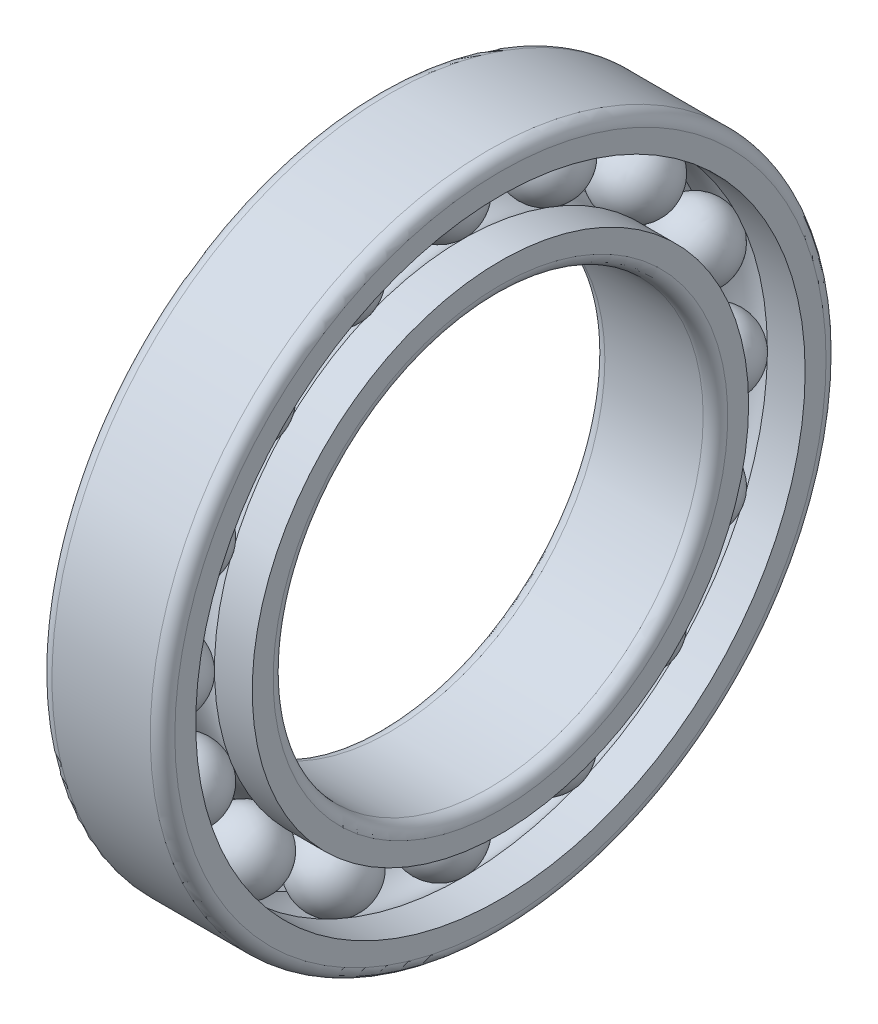
ISO-10303-21;
HEADER;
FILE_DESCRIPTION(('STEP AP214'),'2;1');
FILE_NAME('part.step','',(''),(''),'','','');
FILE_SCHEMA(('AUTOMOTIVE_DESIGN { 1 0 10303 214 1 1 1 1 }'));
ENDSEC;
DATA;
#1=APPLICATION_CONTEXT('core data for automotive mechanical design processes');
#2=APPLICATION_PROTOCOL_DEFINITION('international standard','automotive_design',2000,#1);
#3=PRODUCT_CONTEXT('',#1,'mechanical');
#4=PRODUCT('Part','Part','',(#3));
#5=PRODUCT_RELATED_PRODUCT_CATEGORY('part','',(#4));
#6=PRODUCT_DEFINITION_FORMATION('','',#4);
#7=PRODUCT_DEFINITION_CONTEXT('part definition',#1,'design');
#8=PRODUCT_DEFINITION('design','',#6,#7);
#9=PRODUCT_DEFINITION_SHAPE('','',#8);
#10=(LENGTH_UNIT() NAMED_UNIT(*) SI_UNIT(.MILLI.,.METRE.));
#11=(NAMED_UNIT(*) PLANE_ANGLE_UNIT() SI_UNIT($,.RADIAN.));
#12=(NAMED_UNIT(*) SI_UNIT($,.STERADIAN.) SOLID_ANGLE_UNIT());
#13=UNCERTAINTY_MEASURE_WITH_UNIT(LENGTH_MEASURE(1.E-05),#10,'distance_accuracy_value','');
#14=(GEOMETRIC_REPRESENTATION_CONTEXT(3) GLOBAL_UNCERTAINTY_ASSIGNED_CONTEXT((#13)) GLOBAL_UNIT_ASSIGNED_CONTEXT((#10,
#11,#12)) REPRESENTATION_CONTEXT('',''));
#15=CARTESIAN_POINT('',(0.,0.,0.));
#16=DIRECTION('',(0.,0.,1.));
#17=DIRECTION('',(1.,0.,0.));
#18=AXIS2_PLACEMENT_3D('',#15,#16,#17);
#19=CARTESIAN_POINT('',(0.,-15.9099025766973,15.9099025766973));
#20=DIRECTION('',(1.,0.,0.));
#21=DIRECTION('',(0.,-0.707106781186548,-0.707106781186547));
#22=AXIS2_PLACEMENT_3D('',#19,#20,#21);
#23=SPHERICAL_SURFACE('',#22,3.);
#24=CARTESIAN_POINT('',(-2.99999999999999,-15.9099025766973,15.9099025766973));
#25=VERTEX_POINT('',#24);
#26=VERTEX_LOOP('',#25);
#27=FACE_BOUND('',#26,.T.);
#28=CARTESIAN_POINT('',(3.00000000000001,-15.9099025766973,15.9099025766973));
#29=VERTEX_POINT('',#28);
#30=VERTEX_LOOP('',#29);
#31=FACE_BOUND('',#30,.T.);
#32=ADVANCED_FACE('P0_F15',(#27,#31),#23,.T.);
#33=CLOSED_SHELL('',(#32));
#34=MANIFOLD_SOLID_BREP('P0_B1',#33);
#35=CARTESIAN_POINT('',(0.,-8.61037722821452,20.787289481504));
#36=DIRECTION('',(1.,0.,0.));
#37=DIRECTION('',(0.,-0.923879532511287,-0.38268343236509));
#38=AXIS2_PLACEMENT_3D('',#35,#36,#37);
#39=SPHERICAL_SURFACE('',#38,3.);
#40=CARTESIAN_POINT('',(-2.99999999999999,-8.61037722821452,20.787289481504));
#41=VERTEX_POINT('',#40);
#42=VERTEX_LOOP('',#41);
#43=FACE_BOUND('',#42,.T.);
#44=CARTESIAN_POINT('',(3.00000000000001,-8.61037722821452,20.787289481504));
#45=VERTEX_POINT('',#44);
#46=VERTEX_LOOP('',#45);
#47=FACE_BOUND('',#46,.T.);
#48=ADVANCED_FACE('P1_F15',(#43,#47),#39,.T.);
#49=CLOSED_SHELL('',(#48));
#50=MANIFOLD_SOLID_BREP('P1_B1',#49);
#51=CARTESIAN_POINT('',(0.,-20.787289481504,8.61037722821452));
#52=DIRECTION('',(1.,0.,0.));
#53=DIRECTION('',(0.,-0.38268343236509,-0.923879532511287));
#54=AXIS2_PLACEMENT_3D('',#51,#52,#53);
#55=SPHERICAL_SURFACE('',#54,3.);
#56=CARTESIAN_POINT('',(-2.99999999999999,-20.787289481504,8.61037722821452));
#57=VERTEX_POINT('',#56);
#58=VERTEX_LOOP('',#57);
#59=FACE_BOUND('',#58,.T.);
#60=CARTESIAN_POINT('',(3.00000000000001,-20.787289481504,8.61037722821452));
#61=VERTEX_POINT('',#60);
#62=VERTEX_LOOP('',#61);
#63=FACE_BOUND('',#62,.T.);
#64=ADVANCED_FACE('P2_F15',(#59,#63),#55,.T.);
#65=CLOSED_SHELL('',(#64));
#66=MANIFOLD_SOLID_BREP('P2_B1',#65);
#67=CARTESIAN_POINT('',(0.,-22.5,0.));
#68=DIRECTION('',(1.,0.,0.));
#69=DIRECTION('',(0.,0.,-1.));
#70=AXIS2_PLACEMENT_3D('',#67,#68,#69);
#71=SPHERICAL_SURFACE('',#70,3.);
#72=CARTESIAN_POINT('',(-2.99999999999999,-22.5,0.));
#73=VERTEX_POINT('',#72);
#74=VERTEX_LOOP('',#73);
#75=FACE_BOUND('',#74,.T.);
#76=CARTESIAN_POINT('',(3.00000000000001,-22.5,0.));
#77=VERTEX_POINT('',#76);
#78=VERTEX_LOOP('',#77);
#79=FACE_BOUND('',#78,.T.);
#80=ADVANCED_FACE('P3_F15',(#75,#79),#71,.T.);
#81=CLOSED_SHELL('',(#80));
#82=MANIFOLD_SOLID_BREP('P3_B1',#81);
#83=CARTESIAN_POINT('',(0.,-20.787289481504,-8.61037722821452));
#84=DIRECTION('',(1.,0.,0.));
#85=DIRECTION('',(0.,0.38268343236509,-0.923879532511287));
#86=AXIS2_PLACEMENT_3D('',#83,#84,#85);
#87=SPHERICAL_SURFACE('',#86,3.);
#88=CARTESIAN_POINT('',(-2.99999999999999,-20.787289481504,-8.61037722821452));
#89=VERTEX_POINT('',#88);
#90=VERTEX_LOOP('',#89);
#91=FACE_BOUND('',#90,.T.);
#92=CARTESIAN_POINT('',(3.00000000000001,-20.787289481504,-8.61037722821452));
#93=VERTEX_POINT('',#92);
#94=VERTEX_LOOP('',#93);
#95=FACE_BOUND('',#94,.T.);
#96=ADVANCED_FACE('P4_F15',(#91,#95),#87,.T.);
#97=CLOSED_SHELL('',(#96));
#98=MANIFOLD_SOLID_BREP('P4_B1',#97);
#99=CARTESIAN_POINT('',(0.,-15.9099025766973,-15.9099025766973));
#100=DIRECTION('',(1.,0.,0.));
#101=DIRECTION('',(0.,0.707106781186547,-0.707106781186548));
#102=AXIS2_PLACEMENT_3D('',#99,#100,#101);
#103=SPHERICAL_SURFACE('',#102,3.);
#104=CARTESIAN_POINT('',(-2.99999999999999,-15.9099025766973,-15.9099025766973));
#105=VERTEX_POINT('',#104);
#106=VERTEX_LOOP('',#105);
#107=FACE_BOUND('',#106,.T.);
#108=CARTESIAN_POINT('',(3.00000000000001,-15.9099025766973,-15.9099025766973));
#109=VERTEX_POINT('',#108);
#110=VERTEX_LOOP('',#109);
#111=FACE_BOUND('',#110,.T.);
#112=ADVANCED_FACE('P5_F15',(#107,#111),#103,.T.);
#113=CLOSED_SHELL('',(#112));
#114=MANIFOLD_SOLID_BREP('P5_B1',#113);
#115=CARTESIAN_POINT('',(0.,-8.61037722821452,-20.787289481504));
#116=DIRECTION('',(1.,0.,0.));
#117=DIRECTION('',(0.,0.923879532511287,-0.38268343236509));
#118=AXIS2_PLACEMENT_3D('',#115,#116,#117);
#119=SPHERICAL_SURFACE('',#118,3.);
#120=CARTESIAN_POINT('',(-2.99999999999999,-8.61037722821452,-20.787289481504));
#121=VERTEX_POINT('',#120);
#122=VERTEX_LOOP('',#121);
#123=FACE_BOUND('',#122,.T.);
#124=CARTESIAN_POINT('',(3.00000000000001,-8.61037722821452,-20.787289481504));
#125=VERTEX_POINT('',#124);
#126=VERTEX_LOOP('',#125);
#127=FACE_BOUND('',#126,.T.);
#128=ADVANCED_FACE('P6_F15',(#123,#127),#119,.T.);
#129=CLOSED_SHELL('',(#128));
#130=MANIFOLD_SOLID_BREP('P6_B1',#129);
#131=CARTESIAN_POINT('',(0.,0.,-22.5));
#132=DIRECTION('',(1.,0.,0.));
#133=DIRECTION('',(0.,1.,0.));
#134=AXIS2_PLACEMENT_3D('',#131,#132,#133);
#135=SPHERICAL_SURFACE('',#134,3.);
#136=CARTESIAN_POINT('',(-2.99999999999999,0.,-22.5));
#137=VERTEX_POINT('',#136);
#138=VERTEX_LOOP('',#137);
#139=FACE_BOUND('',#138,.T.);
#140=CARTESIAN_POINT('',(3.00000000000001,0.,-22.5));
#141=VERTEX_POINT('',#140);
#142=VERTEX_LOOP('',#141);
#143=FACE_BOUND('',#142,.T.);
#144=ADVANCED_FACE('P7_F15',(#139,#143),#135,.T.);
#145=CLOSED_SHELL('',(#144));
#146=MANIFOLD_SOLID_BREP('P7_B1',#145);
#147=CARTESIAN_POINT('',(0.,8.61037722821452,-20.787289481504));
#148=DIRECTION('',(1.,0.,0.));
#149=DIRECTION('',(0.,0.923879532511287,0.38268343236509));
#150=AXIS2_PLACEMENT_3D('',#147,#148,#149);
#151=SPHERICAL_SURFACE('',#150,3.);
#152=CARTESIAN_POINT('',(-2.99999999999999,8.61037722821452,-20.787289481504));
#153=VERTEX_POINT('',#152);
#154=VERTEX_LOOP('',#153);
#155=FACE_BOUND('',#154,.T.);
#156=CARTESIAN_POINT('',(3.00000000000001,8.61037722821452,-20.787289481504));
#157=VERTEX_POINT('',#156);
#158=VERTEX_LOOP('',#157);
#159=FACE_BOUND('',#158,.T.);
#160=ADVANCED_FACE('P8_F15',(#155,#159),#151,.T.);
#161=CLOSED_SHELL('',(#160));
#162=MANIFOLD_SOLID_BREP('P8_B1',#161);
#163=CARTESIAN_POINT('',(0.,15.9099025766973,-15.9099025766973));
#164=DIRECTION('',(1.,0.,0.));
#165=DIRECTION('',(0.,0.707106781186548,0.707106781186547));
#166=AXIS2_PLACEMENT_3D('',#163,#164,#165);
#167=SPHERICAL_SURFACE('',#166,3.);
#168=CARTESIAN_POINT('',(-2.99999999999999,15.9099025766973,-15.9099025766973));
#169=VERTEX_POINT('',#168);
#170=VERTEX_LOOP('',#169);
#171=FACE_BOUND('',#170,.T.);
#172=CARTESIAN_POINT('',(3.00000000000001,15.9099025766973,-15.9099025766973));
#173=VERTEX_POINT('',#172);
#174=VERTEX_LOOP('',#173);
#175=FACE_BOUND('',#174,.T.);
#176=ADVANCED_FACE('P9_F15',(#171,#175),#167,.T.);
#177=CLOSED_SHELL('',(#176));
#178=MANIFOLD_SOLID_BREP('P9_B1',#177);
#179=CARTESIAN_POINT('',(0.,20.787289481504,-8.61037722821452));
#180=DIRECTION('',(1.,0.,0.));
#181=DIRECTION('',(0.,0.38268343236509,0.923879532511287));
#182=AXIS2_PLACEMENT_3D('',#179,#180,#181);
#183=SPHERICAL_SURFACE('',#182,3.);
#184=CARTESIAN_POINT('',(-2.99999999999999,20.787289481504,-8.61037722821452));
#185=VERTEX_POINT('',#184);
#186=VERTEX_LOOP('',#185);
#187=FACE_BOUND('',#186,.T.);
#188=CARTESIAN_POINT('',(3.00000000000001,20.787289481504,-8.61037722821452));
#189=VERTEX_POINT('',#188);
#190=VERTEX_LOOP('',#189);
#191=FACE_BOUND('',#190,.T.);
#192=ADVANCED_FACE('P10_F15',(#187,#191),#183,.T.);
#193=CLOSED_SHELL('',(#192));
#194=MANIFOLD_SOLID_BREP('P10_B1',#193);
#195=CARTESIAN_POINT('',(0.,22.5,0.));
#196=DIRECTION('',(1.,0.,0.));
#197=DIRECTION('',(0.,0.,1.));
#198=AXIS2_PLACEMENT_3D('',#195,#196,#197);
#199=SPHERICAL_SURFACE('',#198,3.);
#200=CARTESIAN_POINT('',(-2.99999999999999,22.5,0.));
#201=VERTEX_POINT('',#200);
#202=VERTEX_LOOP('',#201);
#203=FACE_BOUND('',#202,.T.);
#204=CARTESIAN_POINT('',(3.00000000000001,22.5,0.));
#205=VERTEX_POINT('',#204);
#206=VERTEX_LOOP('',#205);
#207=FACE_BOUND('',#206,.T.);
#208=ADVANCED_FACE('P11_F15',(#203,#207),#199,.T.);
#209=CLOSED_SHELL('',(#208));
#210=MANIFOLD_SOLID_BREP('P11_B1',#209);
#211=CARTESIAN_POINT('',(0.,0.,0.));
#212=DIRECTION('',(1.,0.,0.));
#213=DIRECTION('',(0.,1.,0.));
#214=AXIS2_PLACEMENT_3D('',#211,#212,#213);
#215=TOROIDAL_SURFACE('',#214,22.5,3.);
#216=CARTESIAN_POINT('',(-1.92613602842582,0.,0.));
#217=DIRECTION('',(1.,0.,0.));
#218=DIRECTION('',(0.,0.,-1.));
#219=AXIS2_PLACEMENT_3D('',#216,#217,#218);
#220=CIRCLE('',#219,24.8);
#221=CARTESIAN_POINT('',(-1.92613602842582,0.,-24.8));
#222=VERTEX_POINT('',#221);
#223=EDGE_CURVE('P12_E109',#222,#222,#220,.F.);
#224=ORIENTED_EDGE('',*,*,#223,.T.);
#225=EDGE_LOOP('',(#224));
#226=FACE_BOUND('',#225,.T.);
#227=CARTESIAN_POINT('',(1.92613602842582,0.,0.));
#228=DIRECTION('',(1.,0.,0.));
#229=DIRECTION('',(0.,0.,-1.));
#230=AXIS2_PLACEMENT_3D('',#227,#228,#229);
#231=CIRCLE('',#230,24.8);
#232=CARTESIAN_POINT('',(1.92613602842582,0.,-24.8));
#233=VERTEX_POINT('',#232);
#234=EDGE_CURVE('P12_E114',#233,#233,#231,.T.);
#235=ORIENTED_EDGE('',*,*,#234,.T.);
#236=EDGE_LOOP('',(#235));
#237=FACE_BOUND('',#236,.T.);
#238=ADVANCED_FACE('P12_F14',(#226,#237),#215,.F.);
#239=CARTESIAN_POINT('',(5.00000000000002,0.,0.));
#240=DIRECTION('',(1.,0.,0.));
#241=DIRECTION('',(0.,0.,-1.));
#242=AXIS2_PLACEMENT_3D('',#239,#240,#241);
#243=CYLINDRICAL_SURFACE('',#242,24.8);
#244=ORIENTED_EDGE('',*,*,#234,.F.);
#245=EDGE_LOOP('',(#244));
#246=FACE_BOUND('',#245,.T.);
#247=CARTESIAN_POINT('',(5.00000000000002,0.,0.));
#248=DIRECTION('',(1.,0.,0.));
#249=DIRECTION('',(0.,0.,-1.));
#250=AXIS2_PLACEMENT_3D('',#247,#248,#249);
#251=CIRCLE('',#250,24.8);
#252=CARTESIAN_POINT('',(5.00000000000002,0.,-24.8));
#253=VERTEX_POINT('',#252);
#254=EDGE_CURVE('P12_E18',#253,#253,#251,.F.);
#255=ORIENTED_EDGE('',*,*,#254,.F.);
#256=EDGE_LOOP('',(#255));
#257=FACE_BOUND('',#256,.T.);
#258=ADVANCED_FACE('P12_F85',(#246,#257),#243,.F.);
#259=CARTESIAN_POINT('',(5.00000000000002,0.,0.));
#260=DIRECTION('',(1.,0.,0.));
#261=DIRECTION('',(0.,0.,-1.));
#262=AXIS2_PLACEMENT_3D('',#259,#260,#261);
#263=CYLINDRICAL_SURFACE('',#262,24.8);
#264=CARTESIAN_POINT('',(-4.99999999999998,0.,0.));
#265=DIRECTION('',(1.,0.,0.));
#266=DIRECTION('',(0.,0.,-1.));
#267=AXIS2_PLACEMENT_3D('',#264,#265,#266);
#268=CIRCLE('',#267,24.8);
#269=CARTESIAN_POINT('',(-4.99999999999998,0.,-24.8));
#270=VERTEX_POINT('',#269);
#271=EDGE_CURVE('P12_E104',#270,#270,#268,.T.);
#272=ORIENTED_EDGE('',*,*,#271,.F.);
#273=EDGE_LOOP('',(#272));
#274=FACE_BOUND('',#273,.T.);
#275=ORIENTED_EDGE('',*,*,#223,.F.);
#276=EDGE_LOOP('',(#275));
#277=FACE_BOUND('',#276,.T.);
#278=ADVANCED_FACE('P12_F81',(#274,#277),#263,.F.);
#279=CARTESIAN_POINT('',(5.00000000000002,0.,0.));
#280=DIRECTION('',(1.,0.,0.));
#281=DIRECTION('',(0.,0.,-1.));
#282=AXIS2_PLACEMENT_3D('',#279,#280,#281);
#283=PLANE('',#282);
#284=ORIENTED_EDGE('',*,*,#254,.T.);
#285=EDGE_LOOP('',(#284));
#286=FACE_BOUND('',#285,.T.);
#287=CARTESIAN_POINT('',(5.00000000000002,0.,0.));
#288=DIRECTION('',(-1.,0.,0.));
#289=DIRECTION('',(0.,1.,0.));
#290=AXIS2_PLACEMENT_3D('',#287,#288,#289);
#291=CIRCLE('',#290,26.5);
#292=CARTESIAN_POINT('',(5.00000000000002,26.5,0.));
#293=VERTEX_POINT('',#292);
#294=EDGE_CURVE('P12_E65',#293,#293,#291,.T.);
#295=ORIENTED_EDGE('',*,*,#294,.F.);
#296=EDGE_LOOP('',(#295));
#297=FACE_BOUND('',#296,.T.);
#298=ADVANCED_FACE('P12_F71',(#286,#297),#283,.T.);
#299=CARTESIAN_POINT('',(-4.99999999999998,0.,0.));
#300=DIRECTION('',(-1.,0.,0.));
#301=DIRECTION('',(0.,0.,1.));
#302=AXIS2_PLACEMENT_3D('',#299,#300,#301);
#303=PLANE('',#302);
#304=ORIENTED_EDGE('',*,*,#271,.T.);
#305=EDGE_LOOP('',(#304));
#306=FACE_BOUND('',#305,.T.);
#307=CARTESIAN_POINT('',(-4.99999999999998,0.,0.));
#308=DIRECTION('',(1.,0.,0.));
#309=DIRECTION('',(0.,1.,0.));
#310=AXIS2_PLACEMENT_3D('',#307,#308,#309);
#311=CIRCLE('',#310,26.5);
#312=CARTESIAN_POINT('',(-4.99999999999998,26.5,0.));
#313=VERTEX_POINT('',#312);
#314=EDGE_CURVE('P12_E27',#313,#313,#311,.T.);
#315=ORIENTED_EDGE('',*,*,#314,.F.);
#316=EDGE_LOOP('',(#315));
#317=FACE_BOUND('',#316,.T.);
#318=ADVANCED_FACE('P12_F80',(#306,#317),#303,.T.);
#319=CARTESIAN_POINT('',(4.00000000000002,0.,0.));
#320=DIRECTION('',(1.,0.,0.));
#321=DIRECTION('',(0.,1.,0.));
#322=AXIS2_PLACEMENT_3D('',#319,#320,#321);
#323=TOROIDAL_SURFACE('',#322,26.5,1.);
#324=CARTESIAN_POINT('',(4.00000000000002,0.,0.));
#325=DIRECTION('',(1.,0.,0.));
#326=DIRECTION('',(0.,0.,-1.));
#327=AXIS2_PLACEMENT_3D('',#324,#325,#326);
#328=CIRCLE('',#327,27.5);
#329=CARTESIAN_POINT('',(4.00000000000002,0.,-27.5));
#330=VERTEX_POINT('',#329);
#331=EDGE_CURVE('P12_E22',#330,#330,#328,.F.);
#332=ORIENTED_EDGE('',*,*,#331,.F.);
#333=EDGE_LOOP('',(#332));
#334=FACE_BOUND('',#333,.T.);
#335=ORIENTED_EDGE('',*,*,#294,.T.);
#336=EDGE_LOOP('',(#335));
#337=FACE_BOUND('',#336,.T.);
#338=ADVANCED_FACE('P12_F45',(#334,#337),#323,.T.);
#339=CARTESIAN_POINT('',(-3.99999999999998,0.,0.));
#340=DIRECTION('',(1.,0.,0.));
#341=DIRECTION('',(0.,1.,0.));
#342=AXIS2_PLACEMENT_3D('',#339,#340,#341);
#343=TOROIDAL_SURFACE('',#342,26.5,1.);
#344=ORIENTED_EDGE('',*,*,#314,.T.);
#345=EDGE_LOOP('',(#344));
#346=FACE_BOUND('',#345,.T.);
#347=CARTESIAN_POINT('',(-3.99999999999998,0.,0.));
#348=DIRECTION('',(1.,0.,0.));
#349=DIRECTION('',(0.,0.,-1.));
#350=AXIS2_PLACEMENT_3D('',#347,#348,#349);
#351=CIRCLE('',#350,27.5);
#352=CARTESIAN_POINT('',(-3.99999999999998,0.,-27.5));
#353=VERTEX_POINT('',#352);
#354=EDGE_CURVE('P12_E10',#353,#353,#351,.T.);
#355=ORIENTED_EDGE('',*,*,#354,.F.);
#356=EDGE_LOOP('',(#355));
#357=FACE_BOUND('',#356,.T.);
#358=ADVANCED_FACE('P12_F39',(#346,#357),#343,.T.);
#359=CARTESIAN_POINT('',(-4.99999999999998,0.,0.));
#360=DIRECTION('',(1.,0.,0.));
#361=DIRECTION('',(0.,0.,-1.));
#362=AXIS2_PLACEMENT_3D('',#359,#360,#361);
#363=CYLINDRICAL_SURFACE('',#362,27.5);
#364=ORIENTED_EDGE('',*,*,#354,.T.);
#365=EDGE_LOOP('',(#364));
#366=FACE_BOUND('',#365,.T.);
#367=ORIENTED_EDGE('',*,*,#331,.T.);
#368=EDGE_LOOP('',(#367));
#369=FACE_BOUND('',#368,.T.);
#370=ADVANCED_FACE('P12_F44',(#366,#369),#363,.T.);
#371=CLOSED_SHELL('',(#238,#258,#278,#298,#318,#338,#358,#370));
#372=MANIFOLD_SOLID_BREP('P12_B1',#371);
#373=CARTESIAN_POINT('',(0.,8.61037722821452,20.787289481504));
#374=DIRECTION('',(1.,0.,0.));
#375=DIRECTION('',(0.,-0.923879532511287,0.38268343236509));
#376=AXIS2_PLACEMENT_3D('',#373,#374,#375);
#377=SPHERICAL_SURFACE('',#376,3.);
#378=CARTESIAN_POINT('',(-2.99999999999999,8.61037722821452,20.787289481504));
#379=VERTEX_POINT('',#378);
#380=VERTEX_LOOP('',#379);
#381=FACE_BOUND('',#380,.T.);
#382=CARTESIAN_POINT('',(3.00000000000001,8.61037722821452,20.787289481504));
#383=VERTEX_POINT('',#382);
#384=VERTEX_LOOP('',#383);
#385=FACE_BOUND('',#384,.T.);
#386=ADVANCED_FACE('P13_F15',(#381,#385),#377,.T.);
#387=CLOSED_SHELL('',(#386));
#388=MANIFOLD_SOLID_BREP('P13_B1',#387);
#389=CARTESIAN_POINT('',(0.,0.,0.));
#390=DIRECTION('',(1.,0.,0.));
#391=DIRECTION('',(0.,1.,0.));
#392=AXIS2_PLACEMENT_3D('',#389,#390,#391);
#393=TOROIDAL_SURFACE('',#392,22.5,3.);
#394=CARTESIAN_POINT('',(-1.92613602842582,0.,0.));
#395=DIRECTION('',(1.,0.,0.));
#396=DIRECTION('',(0.,0.,-1.));
#397=AXIS2_PLACEMENT_3D('',#394,#395,#396);
#398=CIRCLE('',#397,20.2);
#399=CARTESIAN_POINT('',(-1.92613602842582,0.,-20.2));
#400=VERTEX_POINT('',#399);
#401=EDGE_CURVE('P14_E109',#400,#400,#398,.F.);
#402=ORIENTED_EDGE('',*,*,#401,.F.);
#403=EDGE_LOOP('',(#402));
#404=FACE_BOUND('',#403,.T.);
#405=CARTESIAN_POINT('',(1.92613602842582,0.,0.));
#406=DIRECTION('',(1.,0.,0.));
#407=DIRECTION('',(0.,0.,-1.));
#408=AXIS2_PLACEMENT_3D('',#405,#406,#407);
#409=CIRCLE('',#408,20.2);
#410=CARTESIAN_POINT('',(1.92613602842582,0.,-20.2));
#411=VERTEX_POINT('',#410);
#412=EDGE_CURVE('P14_E114',#411,#411,#409,.T.);
#413=ORIENTED_EDGE('',*,*,#412,.F.);
#414=EDGE_LOOP('',(#413));
#415=FACE_BOUND('',#414,.T.);
#416=ADVANCED_FACE('P14_F14',(#404,#415),#393,.F.);
#417=CARTESIAN_POINT('',(-4.99999999999999,0.,0.));
#418=DIRECTION('',(1.,0.,0.));
#419=DIRECTION('',(0.,0.,-1.));
#420=AXIS2_PLACEMENT_3D('',#417,#418,#419);
#421=CYLINDRICAL_SURFACE('',#420,20.2);
#422=ORIENTED_EDGE('',*,*,#412,.T.);
#423=EDGE_LOOP('',(#422));
#424=FACE_BOUND('',#423,.T.);
#425=CARTESIAN_POINT('',(5.,0.,0.));
#426=DIRECTION('',(1.,0.,0.));
#427=DIRECTION('',(0.,0.,-1.));
#428=AXIS2_PLACEMENT_3D('',#425,#426,#427);
#429=CIRCLE('',#428,20.2);
#430=CARTESIAN_POINT('',(5.,0.,-20.2));
#431=VERTEX_POINT('',#430);
#432=EDGE_CURVE('P14_E18',#431,#431,#429,.T.);
#433=ORIENTED_EDGE('',*,*,#432,.F.);
#434=EDGE_LOOP('',(#433));
#435=FACE_BOUND('',#434,.T.);
#436=ADVANCED_FACE('P14_F84',(#424,#435),#421,.T.);
#437=CARTESIAN_POINT('',(-4.99999999999999,0.,0.));
#438=DIRECTION('',(1.,0.,0.));
#439=DIRECTION('',(0.,0.,-1.));
#440=AXIS2_PLACEMENT_3D('',#437,#438,#439);
#441=CYLINDRICAL_SURFACE('',#440,20.2);
#442=CARTESIAN_POINT('',(-4.99999999999999,0.,0.));
#443=DIRECTION('',(1.,0.,0.));
#444=DIRECTION('',(0.,0.,-1.));
#445=AXIS2_PLACEMENT_3D('',#442,#443,#444);
#446=CIRCLE('',#445,20.2);
#447=CARTESIAN_POINT('',(-4.99999999999999,0.,-20.2));
#448=VERTEX_POINT('',#447);
#449=EDGE_CURVE('P14_E104',#448,#448,#446,.F.);
#450=ORIENTED_EDGE('',*,*,#449,.F.);
#451=EDGE_LOOP('',(#450));
#452=FACE_BOUND('',#451,.T.);
#453=ORIENTED_EDGE('',*,*,#401,.T.);
#454=EDGE_LOOP('',(#453));
#455=FACE_BOUND('',#454,.T.);
#456=ADVANCED_FACE('P14_F81',(#452,#455),#441,.T.);
#457=CARTESIAN_POINT('',(5.00000000000001,0.,0.));
#458=DIRECTION('',(1.,0.,0.));
#459=DIRECTION('',(0.,0.,-1.));
#460=AXIS2_PLACEMENT_3D('',#457,#458,#459);
#461=PLANE('',#460);
#462=CARTESIAN_POINT('',(5.00000000000001,0.,0.));
#463=DIRECTION('',(1.,0.,0.));
#464=DIRECTION('',(0.,1.,0.));
#465=AXIS2_PLACEMENT_3D('',#462,#463,#464);
#466=CIRCLE('',#465,18.5);
#467=CARTESIAN_POINT('',(5.00000000000001,18.5,0.));
#468=VERTEX_POINT('',#467);
#469=EDGE_CURVE('P14_E65',#468,#468,#466,.T.);
#470=ORIENTED_EDGE('',*,*,#469,.F.);
#471=EDGE_LOOP('',(#470));
#472=FACE_BOUND('',#471,.T.);
#473=ORIENTED_EDGE('',*,*,#432,.T.);
#474=EDGE_LOOP('',(#473));
#475=FACE_BOUND('',#474,.T.);
#476=ADVANCED_FACE('P14_F71',(#472,#475),#461,.T.);
#477=CARTESIAN_POINT('',(-4.99999999999999,0.,0.));
#478=DIRECTION('',(-1.,0.,0.));
#479=DIRECTION('',(0.,0.,1.));
#480=AXIS2_PLACEMENT_3D('',#477,#478,#479);
#481=PLANE('',#480);
#482=CARTESIAN_POINT('',(-4.99999999999999,0.,0.));
#483=DIRECTION('',(-1.,0.,0.));
#484=DIRECTION('',(0.,1.,0.));
#485=AXIS2_PLACEMENT_3D('',#482,#483,#484);
#486=CIRCLE('',#485,18.5);
#487=CARTESIAN_POINT('',(-4.99999999999999,18.5,0.));
#488=VERTEX_POINT('',#487);
#489=EDGE_CURVE('P14_E27',#488,#488,#486,.T.);
#490=ORIENTED_EDGE('',*,*,#489,.F.);
#491=EDGE_LOOP('',(#490));
#492=FACE_BOUND('',#491,.T.);
#493=ORIENTED_EDGE('',*,*,#449,.T.);
#494=EDGE_LOOP('',(#493));
#495=FACE_BOUND('',#494,.T.);
#496=ADVANCED_FACE('P14_F80',(#492,#495),#481,.T.);
#497=CARTESIAN_POINT('',(4.00000000000001,0.,0.));
#498=DIRECTION('',(1.,0.,0.));
#499=DIRECTION('',(0.,1.,0.));
#500=AXIS2_PLACEMENT_3D('',#497,#498,#499);
#501=TOROIDAL_SURFACE('',#500,18.5,1.);
#502=CARTESIAN_POINT('',(4.00000000000001,0.,0.));
#503=DIRECTION('',(1.,0.,0.));
#504=DIRECTION('',(0.,0.,-1.));
#505=AXIS2_PLACEMENT_3D('',#502,#503,#504);
#506=CIRCLE('',#505,17.5);
#507=CARTESIAN_POINT('',(4.00000000000001,0.,-17.5));
#508=VERTEX_POINT('',#507);
#509=EDGE_CURVE('P14_E22',#508,#508,#506,.F.);
#510=ORIENTED_EDGE('',*,*,#509,.T.);
#511=EDGE_LOOP('',(#510));
#512=FACE_BOUND('',#511,.T.);
#513=ORIENTED_EDGE('',*,*,#469,.T.);
#514=EDGE_LOOP('',(#513));
#515=FACE_BOUND('',#514,.T.);
#516=ADVANCED_FACE('P14_F45',(#512,#515),#501,.T.);
#517=CARTESIAN_POINT('',(-3.99999999999999,0.,0.));
#518=DIRECTION('',(1.,0.,0.));
#519=DIRECTION('',(0.,1.,0.));
#520=AXIS2_PLACEMENT_3D('',#517,#518,#519);
#521=TOROIDAL_SURFACE('',#520,18.5,1.);
#522=ORIENTED_EDGE('',*,*,#489,.T.);
#523=EDGE_LOOP('',(#522));
#524=FACE_BOUND('',#523,.T.);
#525=CARTESIAN_POINT('',(-3.99999999999999,0.,0.));
#526=DIRECTION('',(1.,0.,0.));
#527=DIRECTION('',(0.,0.,-1.));
#528=AXIS2_PLACEMENT_3D('',#525,#526,#527);
#529=CIRCLE('',#528,17.5);
#530=CARTESIAN_POINT('',(-3.99999999999999,0.,-17.5));
#531=VERTEX_POINT('',#530);
#532=EDGE_CURVE('P14_E10',#531,#531,#529,.T.);
#533=ORIENTED_EDGE('',*,*,#532,.T.);
#534=EDGE_LOOP('',(#533));
#535=FACE_BOUND('',#534,.T.);
#536=ADVANCED_FACE('P14_F39',(#524,#535),#521,.T.);
#537=CARTESIAN_POINT('',(5.00000000000001,0.,0.));
#538=DIRECTION('',(1.,0.,0.));
#539=DIRECTION('',(0.,0.,-1.));
#540=AXIS2_PLACEMENT_3D('',#537,#538,#539);
#541=CYLINDRICAL_SURFACE('',#540,17.5);
#542=ORIENTED_EDGE('',*,*,#532,.F.);
#543=EDGE_LOOP('',(#542));
#544=FACE_BOUND('',#543,.T.);
#545=ORIENTED_EDGE('',*,*,#509,.F.);
#546=EDGE_LOOP('',(#545));
#547=FACE_BOUND('',#546,.T.);
#548=ADVANCED_FACE('P14_F44',(#544,#547),#541,.F.);
#549=CLOSED_SHELL('',(#416,#436,#456,#476,#496,#516,#536,#548));
#550=MANIFOLD_SOLID_BREP('P14_B1',#549);
#551=CARTESIAN_POINT('',(0.,20.787289481504,8.6103772282145));
#552=DIRECTION('',(1.,0.,0.));
#553=DIRECTION('',(0.,-0.382683432365089,0.923879532511287));
#554=AXIS2_PLACEMENT_3D('',#551,#552,#553);
#555=SPHERICAL_SURFACE('',#554,3.);
#556=CARTESIAN_POINT('',(-2.99999999999999,20.787289481504,8.6103772282145));
#557=VERTEX_POINT('',#556);
#558=VERTEX_LOOP('',#557);
#559=FACE_BOUND('',#558,.T.);
#560=CARTESIAN_POINT('',(3.00000000000001,20.787289481504,8.6103772282145));
#561=VERTEX_POINT('',#560);
#562=VERTEX_LOOP('',#561);
#563=FACE_BOUND('',#562,.T.);
#564=ADVANCED_FACE('P15_F15',(#559,#563),#555,.T.);
#565=CLOSED_SHELL('',(#564));
#566=MANIFOLD_SOLID_BREP('P15_B1',#565);
#567=CARTESIAN_POINT('',(0.,15.9099025766973,15.9099025766973));
#568=DIRECTION('',(1.,0.,0.));
#569=DIRECTION('',(0.,-0.707106781186547,0.707106781186548));
#570=AXIS2_PLACEMENT_3D('',#567,#568,#569);
#571=SPHERICAL_SURFACE('',#570,3.);
#572=CARTESIAN_POINT('',(-2.99999999999999,15.9099025766973,15.9099025766973));
#573=VERTEX_POINT('',#572);
#574=VERTEX_LOOP('',#573);
#575=FACE_BOUND('',#574,.T.);
#576=CARTESIAN_POINT('',(3.00000000000001,15.9099025766973,15.9099025766973));
#577=VERTEX_POINT('',#576);
#578=VERTEX_LOOP('',#577);
#579=FACE_BOUND('',#578,.T.);
#580=ADVANCED_FACE('P16_F15',(#575,#579),#571,.T.);
#581=CLOSED_SHELL('',(#580));
#582=MANIFOLD_SOLID_BREP('P16_B1',#581);
#583=CARTESIAN_POINT('',(0.,0.,22.5));
#584=DIRECTION('',(1.,0.,0.));
#585=DIRECTION('',(0.,-1.,0.));
#586=AXIS2_PLACEMENT_3D('',#583,#584,#585);
#587=SPHERICAL_SURFACE('',#586,3.);
#588=CARTESIAN_POINT('',(-2.99999999999999,0.,22.5));
#589=VERTEX_POINT('',#588);
#590=VERTEX_LOOP('',#589);
#591=FACE_BOUND('',#590,.T.);
#592=CARTESIAN_POINT('',(3.00000000000001,0.,22.5));
#593=VERTEX_POINT('',#592);
#594=VERTEX_LOOP('',#593);
#595=FACE_BOUND('',#594,.T.);
#596=ADVANCED_FACE('P17_F14',(#591,#595),#587,.T.);
#597=CLOSED_SHELL('',(#596));
#598=MANIFOLD_SOLID_BREP('P17_B1',#597);
#599=ADVANCED_BREP_SHAPE_REPRESENTATION('',(#18,#34,#50,#66,#82,#98,#114,#130,#146,#162,#178,
#194,#210,#372,#388,#550,#566,#582,#598),#14);
#600=SHAPE_DEFINITION_REPRESENTATION(#9,#599);
ENDSEC;
END-ISO-10303-21;
